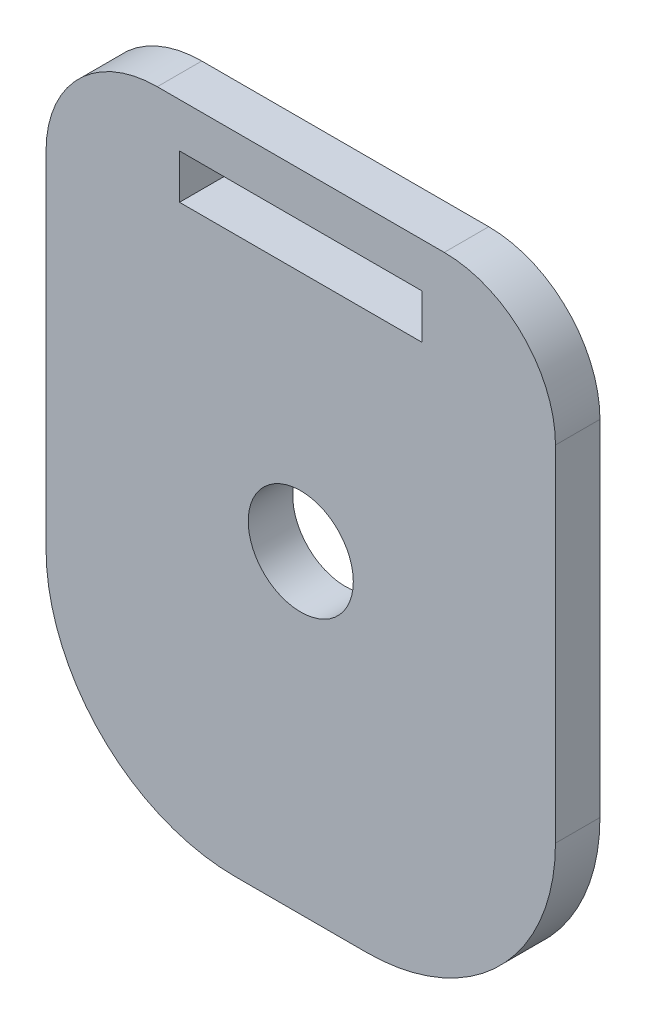
ISO-10303-21;
HEADER;
FILE_DESCRIPTION(('STEP AP214'),'2;1');
FILE_NAME('part.step','',(''),(''),'','','');
FILE_SCHEMA(('AUTOMOTIVE_DESIGN { 1 0 10303 214 1 1 1 1 }'));
ENDSEC;
DATA;
#1=APPLICATION_CONTEXT('core data for automotive mechanical design processes');
#2=APPLICATION_PROTOCOL_DEFINITION('international standard','automotive_design',2000,#1);
#3=PRODUCT_CONTEXT('',#1,'mechanical');
#4=PRODUCT('Part','Part','',(#3));
#5=PRODUCT_RELATED_PRODUCT_CATEGORY('part','',(#4));
#6=PRODUCT_DEFINITION_FORMATION('','',#4);
#7=PRODUCT_DEFINITION_CONTEXT('part definition',#1,'design');
#8=PRODUCT_DEFINITION('design','',#6,#7);
#9=PRODUCT_DEFINITION_SHAPE('','',#8);
#10=(LENGTH_UNIT() NAMED_UNIT(*) SI_UNIT(.MILLI.,.METRE.));
#11=(NAMED_UNIT(*) PLANE_ANGLE_UNIT() SI_UNIT($,.RADIAN.));
#12=(NAMED_UNIT(*) SI_UNIT($,.STERADIAN.) SOLID_ANGLE_UNIT());
#13=UNCERTAINTY_MEASURE_WITH_UNIT(LENGTH_MEASURE(1.E-05),#10,'distance_accuracy_value','');
#14=(GEOMETRIC_REPRESENTATION_CONTEXT(3) GLOBAL_UNCERTAINTY_ASSIGNED_CONTEXT((#13)) GLOBAL_UNIT_ASSIGNED_CONTEXT((#10,
#11,#12)) REPRESENTATION_CONTEXT('',''));
#15=CARTESIAN_POINT('',(0.,0.,0.));
#16=DIRECTION('',(0.,0.,1.));
#17=DIRECTION('',(1.,0.,0.));
#18=AXIS2_PLACEMENT_3D('',#15,#16,#17);
#19=CARTESIAN_POINT('',(0.,0.,5.08));
#20=DIRECTION('',(1.,0.,0.));
#21=DIRECTION('',(0.,0.,-1.));
#22=AXIS2_PLACEMENT_3D('',#19,#20,#21);
#23=PLANE('',#22);
#24=DIRECTION('',(0.,-1.,0.));
#25=VECTOR('',#24,1.);
#26=CARTESIAN_POINT('',(0.,0.,5.08));
#27=LINE('',#26,#25);
#28=CARTESIAN_POINT('',(0.,60.96,5.08));
#29=VERTEX_POINT('',#28);
#30=CARTESIAN_POINT('',(0.,21.59,5.08));
#31=VERTEX_POINT('',#30);
#32=EDGE_CURVE('E172',#29,#31,#27,.T.);
#33=ORIENTED_EDGE('',*,*,#32,.F.);
#34=DIRECTION('',(0.,0.,-1.));
#35=VECTOR('',#34,1.);
#36=CARTESIAN_POINT('',(0.,60.96,5.08));
#37=LINE('',#36,#35);
#38=CARTESIAN_POINT('',(0.,60.96,0.));
#39=VERTEX_POINT('',#38);
#40=EDGE_CURVE('E11',#29,#39,#37,.T.);
#41=ORIENTED_EDGE('',*,*,#40,.T.);
#42=DIRECTION('',(0.,-1.,0.));
#43=VECTOR('',#42,1.);
#44=CARTESIAN_POINT('',(0.,0.,0.));
#45=LINE('',#44,#43);
#46=CARTESIAN_POINT('',(0.,21.59,0.));
#47=VERTEX_POINT('',#46);
#48=EDGE_CURVE('E168',#39,#47,#45,.T.);
#49=ORIENTED_EDGE('',*,*,#48,.T.);
#50=DIRECTION('',(0.,0.,-1.));
#51=VECTOR('',#50,1.);
#52=CARTESIAN_POINT('',(0.,21.59,5.08));
#53=LINE('',#52,#51);
#54=EDGE_CURVE('E207',#47,#31,#53,.F.);
#55=ORIENTED_EDGE('',*,*,#54,.T.);
#56=EDGE_LOOP('',(#33,#41,#49,#55));
#57=FACE_BOUND('',#56,.T.);
#58=ADVANCED_FACE('F32',(#57),#23,.F.);
#59=CARTESIAN_POINT('',(0.,0.,5.08));
#60=DIRECTION('',(0.,1.,0.));
#61=DIRECTION('',(0.,0.,1.));
#62=AXIS2_PLACEMENT_3D('',#59,#60,#61);
#63=PLANE('',#62);
#64=DIRECTION('',(1.,0.,0.));
#65=VECTOR('',#64,1.);
#66=CARTESIAN_POINT('',(0.,0.,0.));
#67=LINE('',#66,#65);
#68=CARTESIAN_POINT('',(21.59,0.,0.));
#69=VERTEX_POINT('',#68);
#70=CARTESIAN_POINT('',(36.576,0.,0.));
#71=VERTEX_POINT('',#70);
#72=EDGE_CURVE('E184',#69,#71,#67,.T.);
#73=ORIENTED_EDGE('',*,*,#72,.T.);
#74=DIRECTION('',(0.,0.,-1.));
#75=VECTOR('',#74,1.);
#76=CARTESIAN_POINT('',(36.576,0.,5.08));
#77=LINE('',#76,#75);
#78=CARTESIAN_POINT('',(36.576,0.,5.08));
#79=VERTEX_POINT('',#78);
#80=EDGE_CURVE('E201',#71,#79,#77,.F.);
#81=ORIENTED_EDGE('',*,*,#80,.T.);
#82=DIRECTION('',(1.,0.,0.));
#83=VECTOR('',#82,1.);
#84=CARTESIAN_POINT('',(0.,0.,5.08));
#85=LINE('',#84,#83);
#86=CARTESIAN_POINT('',(21.59,0.,5.08));
#87=VERTEX_POINT('',#86);
#88=EDGE_CURVE('E174',#87,#79,#85,.T.);
#89=ORIENTED_EDGE('',*,*,#88,.F.);
#90=DIRECTION('',(0.,0.,-1.));
#91=VECTOR('',#90,1.);
#92=CARTESIAN_POINT('',(21.59,0.,5.08));
#93=LINE('',#92,#91);
#94=EDGE_CURVE('E198',#87,#69,#93,.T.);
#95=ORIENTED_EDGE('',*,*,#94,.T.);
#96=EDGE_LOOP('',(#73,#81,#89,#95));
#97=FACE_BOUND('',#96,.T.);
#98=ADVANCED_FACE('F239',(#97),#63,.F.);
#99=CARTESIAN_POINT('',(58.166,0.,5.08));
#100=DIRECTION('',(-1.,0.,0.));
#101=DIRECTION('',(0.,0.,1.));
#102=AXIS2_PLACEMENT_3D('',#99,#100,#101);
#103=PLANE('',#102);
#104=DIRECTION('',(0.,1.,0.));
#105=VECTOR('',#104,1.);
#106=CARTESIAN_POINT('',(58.166,0.,0.));
#107=LINE('',#106,#105);
#108=CARTESIAN_POINT('',(58.166,21.59,0.));
#109=VERTEX_POINT('',#108);
#110=CARTESIAN_POINT('',(58.166,60.96,0.));
#111=VERTEX_POINT('',#110);
#112=EDGE_CURVE('E187',#109,#111,#107,.T.);
#113=ORIENTED_EDGE('',*,*,#112,.T.);
#114=DIRECTION('',(0.,0.,-1.));
#115=VECTOR('',#114,1.);
#116=CARTESIAN_POINT('',(58.166,60.96,5.08));
#117=LINE('',#116,#115);
#118=CARTESIAN_POINT('',(58.166,60.96,5.08));
#119=VERTEX_POINT('',#118);
#120=EDGE_CURVE('E55',#111,#119,#117,.F.);
#121=ORIENTED_EDGE('',*,*,#120,.T.);
#122=DIRECTION('',(0.,1.,0.));
#123=VECTOR('',#122,1.);
#124=CARTESIAN_POINT('',(58.166,0.,5.08));
#125=LINE('',#124,#123);
#126=CARTESIAN_POINT('',(58.166,21.59,5.08));
#127=VERTEX_POINT('',#126);
#128=EDGE_CURVE('E178',#127,#119,#125,.T.);
#129=ORIENTED_EDGE('',*,*,#128,.F.);
#130=DIRECTION('',(0.,0.,-1.));
#131=VECTOR('',#130,1.);
#132=CARTESIAN_POINT('',(58.166,21.59,5.08));
#133=LINE('',#132,#131);
#134=EDGE_CURVE('E182',#127,#109,#133,.T.);
#135=ORIENTED_EDGE('',*,*,#134,.T.);
#136=EDGE_LOOP('',(#113,#121,#129,#135));
#137=FACE_BOUND('',#136,.T.);
#138=ADVANCED_FACE('F231',(#137),#103,.F.);
#139=CARTESIAN_POINT('',(0.,73.66,5.08));
#140=DIRECTION('',(0.,-1.,0.));
#141=DIRECTION('',(0.,0.,-1.));
#142=AXIS2_PLACEMENT_3D('',#139,#140,#141);
#143=PLANE('',#142);
#144=DIRECTION('',(-1.,0.,0.));
#145=VECTOR('',#144,1.);
#146=CARTESIAN_POINT('',(0.,73.66,5.08));
#147=LINE('',#146,#145);
#148=CARTESIAN_POINT('',(45.466,73.66,5.08));
#149=VERTEX_POINT('',#148);
#150=CARTESIAN_POINT('',(12.7,73.66,5.08));
#151=VERTEX_POINT('',#150);
#152=EDGE_CURVE('E180',#149,#151,#147,.T.);
#153=ORIENTED_EDGE('',*,*,#152,.F.);
#154=DIRECTION('',(0.,0.,-1.));
#155=VECTOR('',#154,1.);
#156=CARTESIAN_POINT('',(45.466,73.66,5.08));
#157=LINE('',#156,#155);
#158=CARTESIAN_POINT('',(45.466,73.66,0.));
#159=VERTEX_POINT('',#158);
#160=EDGE_CURVE('E212',#149,#159,#157,.T.);
#161=ORIENTED_EDGE('',*,*,#160,.T.);
#162=DIRECTION('',(-1.,0.,0.));
#163=VECTOR('',#162,1.);
#164=CARTESIAN_POINT('',(0.,73.66,0.));
#165=LINE('',#164,#163);
#166=CARTESIAN_POINT('',(12.7,73.66,0.));
#167=VERTEX_POINT('',#166);
#168=EDGE_CURVE('E175',#159,#167,#165,.T.);
#169=ORIENTED_EDGE('',*,*,#168,.T.);
#170=DIRECTION('',(0.,0.,-1.));
#171=VECTOR('',#170,1.);
#172=CARTESIAN_POINT('',(12.7,73.66,5.08));
#173=LINE('',#172,#171);
#174=EDGE_CURVE('E210',#167,#151,#173,.F.);
#175=ORIENTED_EDGE('',*,*,#174,.T.);
#176=EDGE_LOOP('',(#153,#161,#169,#175));
#177=FACE_BOUND('',#176,.T.);
#178=ADVANCED_FACE('F226',(#177),#143,.F.);
#179=CARTESIAN_POINT('',(0.,0.,5.08));
#180=DIRECTION('',(0.,0.,-1.));
#181=DIRECTION('',(-1.,0.,0.));
#182=AXIS2_PLACEMENT_3D('',#179,#180,#181);
#183=PLANE('',#182);
#184=CARTESIAN_POINT('',(29.083,35.9,5.08));
#185=DIRECTION('',(0.,0.,1.));
#186=DIRECTION('',(1.,0.,0.));
#187=AXIS2_PLACEMENT_3D('',#184,#185,#186);
#188=CIRCLE('',#187,6.);
#189=CARTESIAN_POINT('',(35.083,35.9,5.08));
#190=VERTEX_POINT('',#189);
#191=EDGE_CURVE('E155',#190,#190,#188,.T.);
#192=ORIENTED_EDGE('',*,*,#191,.F.);
#193=EDGE_LOOP('',(#192));
#194=FACE_BOUND('',#193,.T.);
#195=DIRECTION('',(1.,0.,0.));
#196=VECTOR('',#195,1.);
#197=CARTESIAN_POINT('',(15.24,63.5,5.08));
#198=LINE('',#197,#196);
#199=CARTESIAN_POINT('',(15.24,63.5,5.08));
#200=VERTEX_POINT('',#199);
#201=CARTESIAN_POINT('',(42.926,63.5,5.08));
#202=VERTEX_POINT('',#201);
#203=EDGE_CURVE('E161',#200,#202,#198,.T.);
#204=ORIENTED_EDGE('',*,*,#203,.F.);
#205=DIRECTION('',(0.,-1.,0.));
#206=VECTOR('',#205,1.);
#207=CARTESIAN_POINT('',(15.24,68.58,5.08));
#208=LINE('',#207,#206);
#209=CARTESIAN_POINT('',(15.24,68.58,5.08));
#210=VERTEX_POINT('',#209);
#211=EDGE_CURVE('E131',#210,#200,#208,.T.);
#212=ORIENTED_EDGE('',*,*,#211,.F.);
#213=DIRECTION('',(-1.,0.,0.));
#214=VECTOR('',#213,1.);
#215=CARTESIAN_POINT('',(15.24,68.58,5.08));
#216=LINE('',#215,#214);
#217=CARTESIAN_POINT('',(42.926,68.58,5.08));
#218=VERTEX_POINT('',#217);
#219=EDGE_CURVE('E149',#218,#210,#216,.T.);
#220=ORIENTED_EDGE('',*,*,#219,.F.);
#221=DIRECTION('',(0.,1.,0.));
#222=VECTOR('',#221,1.);
#223=CARTESIAN_POINT('',(42.926,68.58,5.08));
#224=LINE('',#223,#222);
#225=EDGE_CURVE('E152',#202,#218,#224,.T.);
#226=ORIENTED_EDGE('',*,*,#225,.F.);
#227=EDGE_LOOP('',(#204,#212,#220,#226));
#228=FACE_BOUND('',#227,.T.);
#229=ORIENTED_EDGE('',*,*,#128,.T.);
#230=CARTESIAN_POINT('',(45.466,60.96,5.08));
#231=DIRECTION('',(0.,0.,-1.));
#232=DIRECTION('',(-1.,0.,0.));
#233=AXIS2_PLACEMENT_3D('',#230,#231,#232);
#234=CIRCLE('',#233,12.7);
#235=EDGE_CURVE('E40',#119,#149,#234,.F.);
#236=ORIENTED_EDGE('',*,*,#235,.T.);
#237=ORIENTED_EDGE('',*,*,#152,.T.);
#238=CARTESIAN_POINT('',(12.7,60.96,5.08));
#239=DIRECTION('',(0.,0.,-1.));
#240=DIRECTION('',(-1.,0.,0.));
#241=AXIS2_PLACEMENT_3D('',#238,#239,#240);
#242=CIRCLE('',#241,12.7);
#243=EDGE_CURVE('E47',#151,#29,#242,.F.);
#244=ORIENTED_EDGE('',*,*,#243,.T.);
#245=ORIENTED_EDGE('',*,*,#32,.T.);
#246=CARTESIAN_POINT('',(21.59,21.59,5.08));
#247=DIRECTION('',(0.,0.,-1.));
#248=DIRECTION('',(-1.,0.,0.));
#249=AXIS2_PLACEMENT_3D('',#246,#247,#248);
#250=CIRCLE('',#249,21.59);
#251=EDGE_CURVE('E203',#31,#87,#250,.F.);
#252=ORIENTED_EDGE('',*,*,#251,.T.);
#253=ORIENTED_EDGE('',*,*,#88,.T.);
#254=CARTESIAN_POINT('',(36.576,21.59,5.08));
#255=DIRECTION('',(0.,0.,-1.));
#256=DIRECTION('',(-1.,0.,0.));
#257=AXIS2_PLACEMENT_3D('',#254,#255,#256);
#258=CIRCLE('',#257,21.59);
#259=EDGE_CURVE('E205',#79,#127,#258,.F.);
#260=ORIENTED_EDGE('',*,*,#259,.T.);
#261=EDGE_LOOP('',(#229,#236,#237,#244,#245,#252,#253,#260));
#262=FACE_BOUND('',#261,.T.);
#263=ADVANCED_FACE('F222',(#194,#228,#262),#183,.F.);
#264=CARTESIAN_POINT('',(0.,0.,0.));
#265=DIRECTION('',(0.,0.,-1.));
#266=DIRECTION('',(-1.,0.,0.));
#267=AXIS2_PLACEMENT_3D('',#264,#265,#266);
#268=PLANE('',#267);
#269=CARTESIAN_POINT('',(29.083,35.9,0.));
#270=DIRECTION('',(0.,0.,1.));
#271=DIRECTION('',(1.,0.,0.));
#272=AXIS2_PLACEMENT_3D('',#269,#270,#271);
#273=CIRCLE('',#272,6.);
#274=CARTESIAN_POINT('',(35.083,35.9,0.));
#275=VERTEX_POINT('',#274);
#276=EDGE_CURVE('E162',#275,#275,#273,.T.);
#277=ORIENTED_EDGE('',*,*,#276,.T.);
#278=EDGE_LOOP('',(#277));
#279=FACE_BOUND('',#278,.T.);
#280=DIRECTION('',(0.,-1.,0.));
#281=VECTOR('',#280,1.);
#282=CARTESIAN_POINT('',(15.24,68.58,0.));
#283=LINE('',#282,#281);
#284=CARTESIAN_POINT('',(15.24,68.58,0.));
#285=VERTEX_POINT('',#284);
#286=CARTESIAN_POINT('',(15.24,63.5,0.));
#287=VERTEX_POINT('',#286);
#288=EDGE_CURVE('E128',#285,#287,#283,.T.);
#289=ORIENTED_EDGE('',*,*,#288,.T.);
#290=DIRECTION('',(1.,0.,0.));
#291=VECTOR('',#290,1.);
#292=CARTESIAN_POINT('',(15.24,63.5,0.));
#293=LINE('',#292,#291);
#294=CARTESIAN_POINT('',(42.926,63.5,0.));
#295=VERTEX_POINT('',#294);
#296=EDGE_CURVE('E140',#287,#295,#293,.T.);
#297=ORIENTED_EDGE('',*,*,#296,.T.);
#298=DIRECTION('',(0.,1.,0.));
#299=VECTOR('',#298,1.);
#300=CARTESIAN_POINT('',(42.926,68.58,0.));
#301=LINE('',#300,#299);
#302=CARTESIAN_POINT('',(42.926,68.58,0.));
#303=VERTEX_POINT('',#302);
#304=EDGE_CURVE('E144',#295,#303,#301,.T.);
#305=ORIENTED_EDGE('',*,*,#304,.T.);
#306=DIRECTION('',(-1.,0.,0.));
#307=VECTOR('',#306,1.);
#308=CARTESIAN_POINT('',(15.24,68.58,0.));
#309=LINE('',#308,#307);
#310=EDGE_CURVE('E136',#303,#285,#309,.T.);
#311=ORIENTED_EDGE('',*,*,#310,.T.);
#312=EDGE_LOOP('',(#289,#297,#305,#311));
#313=FACE_BOUND('',#312,.T.);
#314=ORIENTED_EDGE('',*,*,#168,.F.);
#315=CARTESIAN_POINT('',(45.466,60.96,0.));
#316=DIRECTION('',(0.,0.,-1.));
#317=DIRECTION('',(-1.,0.,0.));
#318=AXIS2_PLACEMENT_3D('',#315,#316,#317);
#319=CIRCLE('',#318,12.7);
#320=EDGE_CURVE('E217',#159,#111,#319,.T.);
#321=ORIENTED_EDGE('',*,*,#320,.T.);
#322=ORIENTED_EDGE('',*,*,#112,.F.);
#323=CARTESIAN_POINT('',(36.576,21.59,0.));
#324=DIRECTION('',(0.,0.,-1.));
#325=DIRECTION('',(-1.,0.,0.));
#326=AXIS2_PLACEMENT_3D('',#323,#324,#325);
#327=CIRCLE('',#326,21.59);
#328=EDGE_CURVE('E196',#109,#71,#327,.T.);
#329=ORIENTED_EDGE('',*,*,#328,.T.);
#330=ORIENTED_EDGE('',*,*,#72,.F.);
#331=CARTESIAN_POINT('',(21.59,21.59,0.));
#332=DIRECTION('',(0.,0.,-1.));
#333=DIRECTION('',(-1.,0.,0.));
#334=AXIS2_PLACEMENT_3D('',#331,#332,#333);
#335=CIRCLE('',#334,21.59);
#336=EDGE_CURVE('E193',#69,#47,#335,.T.);
#337=ORIENTED_EDGE('',*,*,#336,.T.);
#338=ORIENTED_EDGE('',*,*,#48,.F.);
#339=CARTESIAN_POINT('',(12.7,60.96,0.));
#340=DIRECTION('',(0.,0.,-1.));
#341=DIRECTION('',(-1.,0.,0.));
#342=AXIS2_PLACEMENT_3D('',#339,#340,#341);
#343=CIRCLE('',#342,12.7);
#344=EDGE_CURVE('E215',#39,#167,#343,.T.);
#345=ORIENTED_EDGE('',*,*,#344,.T.);
#346=EDGE_LOOP('',(#314,#321,#322,#329,#330,#337,#338,#345));
#347=FACE_BOUND('',#346,.T.);
#348=ADVANCED_FACE('F146',(#279,#313,#347),#268,.T.);
#349=CARTESIAN_POINT('',(15.24,68.58,0.));
#350=DIRECTION('',(-1.,0.,0.));
#351=DIRECTION('',(0.,-1.,0.));
#352=AXIS2_PLACEMENT_3D('',#349,#350,#351);
#353=PLANE('',#352);
#354=ORIENTED_EDGE('',*,*,#211,.T.);
#355=DIRECTION('',(0.,0.,1.));
#356=VECTOR('',#355,1.);
#357=CARTESIAN_POINT('',(15.24,63.5,0.));
#358=LINE('',#357,#356);
#359=EDGE_CURVE('E124',#287,#200,#358,.T.);
#360=ORIENTED_EDGE('',*,*,#359,.F.);
#361=ORIENTED_EDGE('',*,*,#288,.F.);
#362=DIRECTION('',(0.,0.,1.));
#363=VECTOR('',#362,1.);
#364=CARTESIAN_POINT('',(15.24,68.58,0.));
#365=LINE('',#364,#363);
#366=EDGE_CURVE('E166',#285,#210,#365,.T.);
#367=ORIENTED_EDGE('',*,*,#366,.T.);
#368=EDGE_LOOP('',(#354,#360,#361,#367));
#369=FACE_BOUND('',#368,.T.);
#370=ADVANCED_FACE('F126',(#369),#353,.F.);
#371=CARTESIAN_POINT('',(15.24,68.58,0.));
#372=DIRECTION('',(0.,1.,0.));
#373=DIRECTION('',(0.,0.,1.));
#374=AXIS2_PLACEMENT_3D('',#371,#372,#373);
#375=PLANE('',#374);
#376=ORIENTED_EDGE('',*,*,#219,.T.);
#377=ORIENTED_EDGE('',*,*,#366,.F.);
#378=ORIENTED_EDGE('',*,*,#310,.F.);
#379=DIRECTION('',(0.,0.,1.));
#380=VECTOR('',#379,1.);
#381=CARTESIAN_POINT('',(42.926,68.58,0.));
#382=LINE('',#381,#380);
#383=EDGE_CURVE('E169',#303,#218,#382,.T.);
#384=ORIENTED_EDGE('',*,*,#383,.T.);
#385=EDGE_LOOP('',(#376,#377,#378,#384));
#386=FACE_BOUND('',#385,.T.);
#387=ADVANCED_FACE('F355',(#386),#375,.F.);
#388=CARTESIAN_POINT('',(42.926,68.58,0.));
#389=DIRECTION('',(1.,0.,0.));
#390=DIRECTION('',(0.,0.,-1.));
#391=AXIS2_PLACEMENT_3D('',#388,#389,#390);
#392=PLANE('',#391);
#393=ORIENTED_EDGE('',*,*,#225,.T.);
#394=ORIENTED_EDGE('',*,*,#383,.F.);
#395=ORIENTED_EDGE('',*,*,#304,.F.);
#396=DIRECTION('',(0.,0.,1.));
#397=VECTOR('',#396,1.);
#398=CARTESIAN_POINT('',(42.926,63.5,0.));
#399=LINE('',#398,#397);
#400=EDGE_CURVE('E135',#295,#202,#399,.T.);
#401=ORIENTED_EDGE('',*,*,#400,.T.);
#402=EDGE_LOOP('',(#393,#394,#395,#401));
#403=FACE_BOUND('',#402,.T.);
#404=ADVANCED_FACE('F347',(#403),#392,.F.);
#405=CARTESIAN_POINT('',(15.24,63.5,0.));
#406=DIRECTION('',(0.,-1.,0.));
#407=DIRECTION('',(0.,0.,-1.));
#408=AXIS2_PLACEMENT_3D('',#405,#406,#407);
#409=PLANE('',#408);
#410=ORIENTED_EDGE('',*,*,#203,.T.);
#411=ORIENTED_EDGE('',*,*,#400,.F.);
#412=ORIENTED_EDGE('',*,*,#296,.F.);
#413=ORIENTED_EDGE('',*,*,#359,.T.);
#414=EDGE_LOOP('',(#410,#411,#412,#413));
#415=FACE_BOUND('',#414,.T.);
#416=ADVANCED_FACE('F141',(#415),#409,.F.);
#417=CARTESIAN_POINT('',(29.083,35.9,0.));
#418=DIRECTION('',(0.,0.,1.));
#419=DIRECTION('',(1.,0.,0.));
#420=AXIS2_PLACEMENT_3D('',#417,#418,#419);
#421=CYLINDRICAL_SURFACE('',#420,6.);
#422=ORIENTED_EDGE('',*,*,#276,.F.);
#423=EDGE_LOOP('',(#422));
#424=FACE_BOUND('',#423,.T.);
#425=ORIENTED_EDGE('',*,*,#191,.T.);
#426=EDGE_LOOP('',(#425));
#427=FACE_BOUND('',#426,.T.);
#428=ADVANCED_FACE('F264',(#424,#427),#421,.F.);
#429=CARTESIAN_POINT('',(36.576,21.59,5.08));
#430=DIRECTION('',(0.,0.,-1.));
#431=DIRECTION('',(-1.,0.,0.));
#432=AXIS2_PLACEMENT_3D('',#429,#430,#431);
#433=CYLINDRICAL_SURFACE('',#432,21.59);
#434=ORIENTED_EDGE('',*,*,#259,.F.);
#435=ORIENTED_EDGE('',*,*,#80,.F.);
#436=ORIENTED_EDGE('',*,*,#328,.F.);
#437=ORIENTED_EDGE('',*,*,#134,.F.);
#438=EDGE_LOOP('',(#434,#435,#436,#437));
#439=FACE_BOUND('',#438,.T.);
#440=ADVANCED_FACE('F235',(#439),#433,.T.);
#441=CARTESIAN_POINT('',(21.59,21.59,5.08));
#442=DIRECTION('',(0.,0.,-1.));
#443=DIRECTION('',(-1.,0.,0.));
#444=AXIS2_PLACEMENT_3D('',#441,#442,#443);
#445=CYLINDRICAL_SURFACE('',#444,21.59);
#446=ORIENTED_EDGE('',*,*,#251,.F.);
#447=ORIENTED_EDGE('',*,*,#54,.F.);
#448=ORIENTED_EDGE('',*,*,#336,.F.);
#449=ORIENTED_EDGE('',*,*,#94,.F.);
#450=EDGE_LOOP('',(#446,#447,#448,#449));
#451=FACE_BOUND('',#450,.T.);
#452=ADVANCED_FACE('F244',(#451),#445,.T.);
#453=CARTESIAN_POINT('',(45.466,60.96,5.08));
#454=DIRECTION('',(0.,0.,-1.));
#455=DIRECTION('',(-1.,0.,0.));
#456=AXIS2_PLACEMENT_3D('',#453,#454,#455);
#457=CYLINDRICAL_SURFACE('',#456,12.7);
#458=ORIENTED_EDGE('',*,*,#235,.F.);
#459=ORIENTED_EDGE('',*,*,#120,.F.);
#460=ORIENTED_EDGE('',*,*,#320,.F.);
#461=ORIENTED_EDGE('',*,*,#160,.F.);
#462=EDGE_LOOP('',(#458,#459,#460,#461));
#463=FACE_BOUND('',#462,.T.);
#464=ADVANCED_FACE('F229',(#463),#457,.T.);
#465=CARTESIAN_POINT('',(12.7,60.96,5.08));
#466=DIRECTION('',(0.,0.,-1.));
#467=DIRECTION('',(-1.,0.,0.));
#468=AXIS2_PLACEMENT_3D('',#465,#466,#467);
#469=CYLINDRICAL_SURFACE('',#468,12.7);
#470=ORIENTED_EDGE('',*,*,#243,.F.);
#471=ORIENTED_EDGE('',*,*,#174,.F.);
#472=ORIENTED_EDGE('',*,*,#344,.F.);
#473=ORIENTED_EDGE('',*,*,#40,.F.);
#474=EDGE_LOOP('',(#470,#471,#472,#473));
#475=FACE_BOUND('',#474,.T.);
#476=ADVANCED_FACE('F34',(#475),#469,.T.);
#477=CLOSED_SHELL('',(#58,#98,#138,#178,#263,#348,#370,#387,#404,#416,#428,#440,#452,#464,#476));
#478=MANIFOLD_SOLID_BREP('B2',#477);
#479=ADVANCED_BREP_SHAPE_REPRESENTATION('',(#18,#478),#14);
#480=SHAPE_DEFINITION_REPRESENTATION(#9,#479);
ENDSEC;
END-ISO-10303-21;
